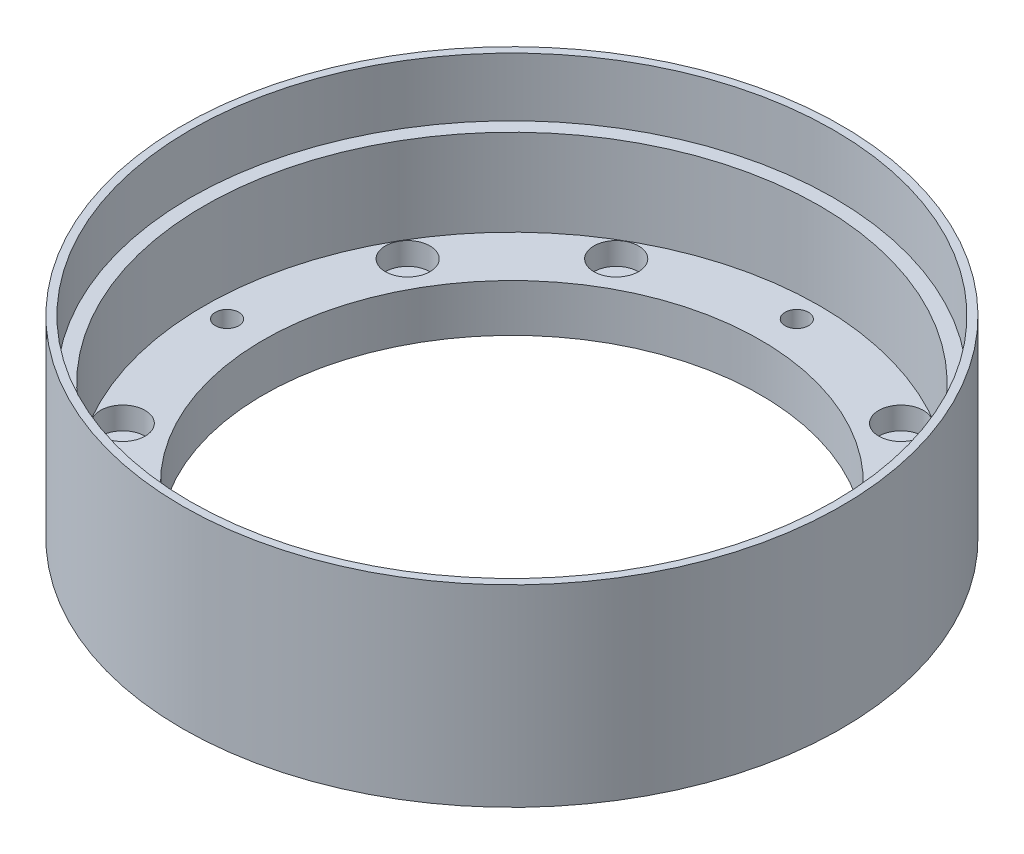
ISO-10303-21;
HEADER;
FILE_DESCRIPTION(('STEP AP214'),'2;1');
FILE_NAME('part.step','',(''),(''),'','','');
FILE_SCHEMA(('AUTOMOTIVE_DESIGN { 1 0 10303 214 1 1 1 1 }'));
ENDSEC;
DATA;
#1=APPLICATION_CONTEXT('core data for automotive mechanical design processes');
#2=APPLICATION_PROTOCOL_DEFINITION('international standard','automotive_design',2000,#1);
#3=PRODUCT_CONTEXT('',#1,'mechanical');
#4=PRODUCT('Part','Part','',(#3));
#5=PRODUCT_RELATED_PRODUCT_CATEGORY('part','',(#4));
#6=PRODUCT_DEFINITION_FORMATION('','',#4);
#7=PRODUCT_DEFINITION_CONTEXT('part definition',#1,'design');
#8=PRODUCT_DEFINITION('design','',#6,#7);
#9=PRODUCT_DEFINITION_SHAPE('','',#8);
#10=(LENGTH_UNIT() NAMED_UNIT(*) SI_UNIT(.MILLI.,.METRE.));
#11=(NAMED_UNIT(*) PLANE_ANGLE_UNIT() SI_UNIT($,.RADIAN.));
#12=(NAMED_UNIT(*) SI_UNIT($,.STERADIAN.) SOLID_ANGLE_UNIT());
#13=UNCERTAINTY_MEASURE_WITH_UNIT(LENGTH_MEASURE(1.E-05),#10,'distance_accuracy_value','');
#14=(GEOMETRIC_REPRESENTATION_CONTEXT(3) GLOBAL_UNCERTAINTY_ASSIGNED_CONTEXT((#13)) GLOBAL_UNIT_ASSIGNED_CONTEXT((#10,
#11,#12)) REPRESENTATION_CONTEXT('',''));
#15=CARTESIAN_POINT('',(0.,0.,0.));
#16=DIRECTION('',(0.,0.,1.));
#17=DIRECTION('',(1.,0.,0.));
#18=AXIS2_PLACEMENT_3D('',#15,#16,#17);
#19=CARTESIAN_POINT('',(-51.,0.,-5.34196644842999E-13));
#20=DIRECTION('',(0.,1.,0.));
#21=DIRECTION('',(0.,0.,1.));
#22=AXIS2_PLACEMENT_3D('',#19,#20,#21);
#23=CYLINDRICAL_SURFACE('',#22,2.1);
#24=CARTESIAN_POINT('',(-51.,8.5,-5.34196644842999E-13));
#25=DIRECTION('',(0.,1.,0.));
#26=DIRECTION('',(0.,0.,1.));
#27=AXIS2_PLACEMENT_3D('',#24,#25,#26);
#28=CIRCLE('',#27,2.1);
#29=CARTESIAN_POINT('',(-51.,8.5,2.09999999999947));
#30=VERTEX_POINT('',#29);
#31=EDGE_CURVE('E82',#30,#30,#28,.T.);
#32=ORIENTED_EDGE('',*,*,#31,.T.);
#33=EDGE_LOOP('',(#32));
#34=FACE_BOUND('',#33,.T.);
#35=CARTESIAN_POINT('',(-51.,5.,-5.34196644842999E-13));
#36=DIRECTION('',(0.,-1.,0.));
#37=DIRECTION('',(0.,0.,-1.));
#38=AXIS2_PLACEMENT_3D('',#35,#36,#37);
#39=CIRCLE('',#38,2.1);
#40=CARTESIAN_POINT('',(-51.,5.,-2.10000000000053));
#41=VERTEX_POINT('',#40);
#42=EDGE_CURVE('E47',#41,#41,#39,.F.);
#43=ORIENTED_EDGE('',*,*,#42,.F.);
#44=EDGE_LOOP('',(#43));
#45=FACE_BOUND('',#44,.T.);
#46=ADVANCED_FACE('F43',(#34,#45),#23,.F.);
#47=CARTESIAN_POINT('',(-3.56131096562E-13,0.,51.));
#48=DIRECTION('',(0.,1.,0.));
#49=DIRECTION('',(0.,0.,1.));
#50=AXIS2_PLACEMENT_3D('',#47,#48,#49);
#51=CYLINDRICAL_SURFACE('',#50,2.1);
#52=CARTESIAN_POINT('',(-3.56131096562E-13,8.5,51.));
#53=DIRECTION('',(0.,1.,0.));
#54=DIRECTION('',(0.,0.,1.));
#55=AXIS2_PLACEMENT_3D('',#52,#53,#54);
#56=CIRCLE('',#55,2.1);
#57=CARTESIAN_POINT('',(-3.56131096562E-13,8.5,53.1));
#58=VERTEX_POINT('',#57);
#59=EDGE_CURVE('E88',#58,#58,#56,.T.);
#60=ORIENTED_EDGE('',*,*,#59,.T.);
#61=EDGE_LOOP('',(#60));
#62=FACE_BOUND('',#61,.T.);
#63=CARTESIAN_POINT('',(-3.56131096562E-13,5.,51.));
#64=DIRECTION('',(0.,-1.,0.));
#65=DIRECTION('',(0.,0.,-1.));
#66=AXIS2_PLACEMENT_3D('',#63,#64,#65);
#67=CIRCLE('',#66,2.1);
#68=CARTESIAN_POINT('',(-3.56131096562E-13,5.,48.9));
#69=VERTEX_POINT('',#68);
#70=EDGE_CURVE('E73',#69,#69,#67,.F.);
#71=ORIENTED_EDGE('',*,*,#70,.F.);
#72=EDGE_LOOP('',(#71));
#73=FACE_BOUND('',#72,.T.);
#74=ADVANCED_FACE('F198',(#62,#73),#51,.F.);
#75=CARTESIAN_POINT('',(51.,0.,1.78065548281E-13));
#76=DIRECTION('',(0.,1.,0.));
#77=DIRECTION('',(0.,0.,1.));
#78=AXIS2_PLACEMENT_3D('',#75,#76,#77);
#79=CYLINDRICAL_SURFACE('',#78,2.1);
#80=CARTESIAN_POINT('',(51.,8.5,1.78065548281E-13));
#81=DIRECTION('',(0.,1.,0.));
#82=DIRECTION('',(0.,0.,1.));
#83=AXIS2_PLACEMENT_3D('',#80,#81,#82);
#84=CIRCLE('',#83,2.1);
#85=CARTESIAN_POINT('',(51.,8.5,2.10000000000018));
#86=VERTEX_POINT('',#85);
#87=EDGE_CURVE('E95',#86,#86,#84,.T.);
#88=ORIENTED_EDGE('',*,*,#87,.T.);
#89=EDGE_LOOP('',(#88));
#90=FACE_BOUND('',#89,.T.);
#91=CARTESIAN_POINT('',(51.,5.,1.78065548281E-13));
#92=DIRECTION('',(0.,-1.,0.));
#93=DIRECTION('',(0.,0.,-1.));
#94=AXIS2_PLACEMENT_3D('',#91,#92,#93);
#95=CIRCLE('',#94,2.1);
#96=CARTESIAN_POINT('',(51.,5.,-2.09999999999982));
#97=VERTEX_POINT('',#96);
#98=EDGE_CURVE('E69',#97,#97,#95,.F.);
#99=ORIENTED_EDGE('',*,*,#98,.F.);
#100=EDGE_LOOP('',(#99));
#101=FACE_BOUND('',#100,.T.);
#102=ADVANCED_FACE('F202',(#90,#101),#79,.F.);
#103=CARTESIAN_POINT('',(0.,0.,-51.));
#104=DIRECTION('',(0.,1.,0.));
#105=DIRECTION('',(0.,0.,1.));
#106=AXIS2_PLACEMENT_3D('',#103,#104,#105);
#107=CYLINDRICAL_SURFACE('',#106,2.1);
#108=CARTESIAN_POINT('',(0.,8.5,-51.));
#109=DIRECTION('',(0.,1.,0.));
#110=DIRECTION('',(0.,0.,1.));
#111=AXIS2_PLACEMENT_3D('',#108,#109,#110);
#112=CIRCLE('',#111,2.1);
#113=CARTESIAN_POINT('',(0.,8.5,-48.9));
#114=VERTEX_POINT('',#113);
#115=EDGE_CURVE('E124',#114,#114,#112,.T.);
#116=ORIENTED_EDGE('',*,*,#115,.T.);
#117=EDGE_LOOP('',(#116));
#118=FACE_BOUND('',#117,.T.);
#119=CARTESIAN_POINT('',(0.,5.,-51.));
#120=DIRECTION('',(0.,-1.,0.));
#121=DIRECTION('',(0.,0.,-1.));
#122=AXIS2_PLACEMENT_3D('',#119,#120,#121);
#123=CIRCLE('',#122,2.1);
#124=CARTESIAN_POINT('',(0.,5.,-53.1));
#125=VERTEX_POINT('',#124);
#126=EDGE_CURVE('E65',#125,#125,#123,.F.);
#127=ORIENTED_EDGE('',*,*,#126,.F.);
#128=EDGE_LOOP('',(#127));
#129=FACE_BOUND('',#128,.T.);
#130=ADVANCED_FACE('F194',(#118,#129),#107,.F.);
#131=CARTESIAN_POINT('',(0.,34.5,0.));
#132=DIRECTION('',(0.,-1.,0.));
#133=DIRECTION('',(0.,0.,-1.));
#134=AXIS2_PLACEMENT_3D('',#131,#132,#133);
#135=CYLINDRICAL_SURFACE('',#134,59.);
#136=CARTESIAN_POINT('',(0.,34.5,0.));
#137=DIRECTION('',(0.,1.,0.));
#138=DIRECTION('',(0.,0.,1.));
#139=AXIS2_PLACEMENT_3D('',#136,#137,#138);
#140=CIRCLE('',#139,59.);
#141=CARTESIAN_POINT('',(0.,34.5,59.));
#142=VERTEX_POINT('',#141);
#143=EDGE_CURVE('E10',#142,#142,#140,.T.);
#144=ORIENTED_EDGE('',*,*,#143,.F.);
#145=EDGE_LOOP('',(#144));
#146=FACE_BOUND('',#145,.T.);
#147=CARTESIAN_POINT('',(0.,0.,0.));
#148=DIRECTION('',(0.,1.,0.));
#149=DIRECTION('',(0.,0.,1.));
#150=AXIS2_PLACEMENT_3D('',#147,#148,#149);
#151=CIRCLE('',#150,59.);
#152=CARTESIAN_POINT('',(0.,0.,59.));
#153=VERTEX_POINT('',#152);
#154=EDGE_CURVE('E52',#153,#153,#151,.T.);
#155=ORIENTED_EDGE('',*,*,#154,.T.);
#156=EDGE_LOOP('',(#155));
#157=FACE_BOUND('',#156,.T.);
#158=ADVANCED_FACE('F45',(#146,#157),#135,.T.);
#159=CARTESIAN_POINT('',(0.,34.5,0.));
#160=DIRECTION('',(0.,1.,0.));
#161=DIRECTION('',(0.,0.,1.));
#162=AXIS2_PLACEMENT_3D('',#159,#160,#161);
#163=PLANE('',#162);
#164=CARTESIAN_POINT('',(0.,34.5,0.));
#165=DIRECTION('',(0.,1.,0.));
#166=DIRECTION('',(0.,0.,1.));
#167=AXIS2_PLACEMENT_3D('',#164,#165,#166);
#168=CIRCLE('',#167,57.6);
#169=CARTESIAN_POINT('',(0.,34.5,57.6));
#170=VERTEX_POINT('',#169);
#171=EDGE_CURVE('E62',#170,#170,#168,.T.);
#172=ORIENTED_EDGE('',*,*,#171,.F.);
#173=EDGE_LOOP('',(#172));
#174=FACE_BOUND('',#173,.T.);
#175=ORIENTED_EDGE('',*,*,#143,.T.);
#176=EDGE_LOOP('',(#175));
#177=FACE_BOUND('',#176,.T.);
#178=ADVANCED_FACE('F186',(#174,#177),#163,.T.);
#179=CARTESIAN_POINT('',(0.,0.,0.));
#180=DIRECTION('',(0.,1.,0.));
#181=DIRECTION('',(0.,0.,1.));
#182=AXIS2_PLACEMENT_3D('',#179,#180,#181);
#183=PLANE('',#182);
#184=CARTESIAN_POINT('',(-3.56131096562E-13,0.,51.));
#185=DIRECTION('',(0.,-1.,0.));
#186=DIRECTION('',(0.,0.,-1.));
#187=AXIS2_PLACEMENT_3D('',#184,#185,#186);
#188=CIRCLE('',#187,3.75);
#189=CARTESIAN_POINT('',(-3.56131096562E-13,0.,47.25));
#190=VERTEX_POINT('',#189);
#191=EDGE_CURVE('E608',#190,#190,#188,.T.);
#192=ORIENTED_EDGE('',*,*,#191,.F.);
#193=EDGE_LOOP('',(#192));
#194=FACE_BOUND('',#193,.T.);
#195=CARTESIAN_POINT('',(51.,0.,1.85004442184907E-13));
#196=DIRECTION('',(0.,-1.,0.));
#197=DIRECTION('',(0.,0.,-1.));
#198=AXIS2_PLACEMENT_3D('',#195,#196,#197);
#199=CIRCLE('',#198,3.75);
#200=CARTESIAN_POINT('',(51.,0.,-3.74999999999982));
#201=VERTEX_POINT('',#200);
#202=EDGE_CURVE('E604',#201,#201,#199,.T.);
#203=ORIENTED_EDGE('',*,*,#202,.F.);
#204=EDGE_LOOP('',(#203));
#205=FACE_BOUND('',#204,.T.);
#206=CARTESIAN_POINT('',(0.,0.,-51.));
#207=DIRECTION('',(0.,-1.,0.));
#208=DIRECTION('',(0.,0.,-1.));
#209=AXIS2_PLACEMENT_3D('',#206,#207,#208);
#210=CIRCLE('',#209,3.75);
#211=CARTESIAN_POINT('',(0.,0.,-54.75));
#212=VERTEX_POINT('',#211);
#213=EDGE_CURVE('E597',#212,#212,#210,.T.);
#214=ORIENTED_EDGE('',*,*,#213,.F.);
#215=EDGE_LOOP('',(#214));
#216=FACE_BOUND('',#215,.T.);
#217=CARTESIAN_POINT('',(-51.,0.,1.78065548281E-13));
#218=DIRECTION('',(0.,-1.,0.));
#219=DIRECTION('',(0.,0.,-1.));
#220=AXIS2_PLACEMENT_3D('',#217,#218,#219);
#221=CIRCLE('',#220,3.75);
#222=CARTESIAN_POINT('',(-51.,0.,-3.74999999999982));
#223=VERTEX_POINT('',#222);
#224=EDGE_CURVE('E589',#223,#223,#221,.T.);
#225=ORIENTED_EDGE('',*,*,#224,.F.);
#226=EDGE_LOOP('',(#225));
#227=FACE_BOUND('',#226,.T.);
#228=CARTESIAN_POINT('',(0.,0.,0.));
#229=DIRECTION('',(0.,1.,0.));
#230=DIRECTION('',(0.,0.,1.));
#231=AXIS2_PLACEMENT_3D('',#228,#229,#230);
#232=CIRCLE('',#231,44.5);
#233=CARTESIAN_POINT('',(0.,0.,44.5));
#234=VERTEX_POINT('',#233);
#235=EDGE_CURVE('E161',#234,#234,#232,.T.);
#236=ORIENTED_EDGE('',*,*,#235,.T.);
#237=EDGE_LOOP('',(#236));
#238=FACE_BOUND('',#237,.T.);
#239=ORIENTED_EDGE('',*,*,#154,.F.);
#240=EDGE_LOOP('',(#239));
#241=FACE_BOUND('',#240,.T.);
#242=ADVANCED_FACE('F188',(#194,#205,#216,#227,#238,#241),#183,.F.);
#243=CARTESIAN_POINT('',(0.,24.,0.));
#244=DIRECTION('',(0.,1.,0.));
#245=DIRECTION('',(0.,0.,1.));
#246=AXIS2_PLACEMENT_3D('',#243,#244,#245);
#247=CYLINDRICAL_SURFACE('',#246,57.6);
#248=CARTESIAN_POINT('',(0.,24.,0.));
#249=DIRECTION('',(0.,1.,0.));
#250=DIRECTION('',(0.,0.,1.));
#251=AXIS2_PLACEMENT_3D('',#248,#249,#250);
#252=CIRCLE('',#251,57.6);
#253=CARTESIAN_POINT('',(0.,24.,57.6));
#254=VERTEX_POINT('',#253);
#255=EDGE_CURVE('E59',#254,#254,#252,.T.);
#256=CARTESIAN_POINT('',(0.,24.,57.6));
#257=CARTESIAN_POINT('',(0.,24.109375,57.6));
#258=CARTESIAN_POINT('',(0.,24.21875,57.6));
#259=CARTESIAN_POINT('',(0.,24.4375,57.6));
#260=CARTESIAN_POINT('',(0.,24.546875,57.6));
#261=CARTESIAN_POINT('',(0.,24.765625,57.6));
#262=CARTESIAN_POINT('',(0.,24.875,57.6));
#263=CARTESIAN_POINT('',(0.,25.09375,57.6));
#264=CARTESIAN_POINT('',(0.,25.203125,57.6));
#265=CARTESIAN_POINT('',(0.,25.421875,57.6));
#266=CARTESIAN_POINT('',(0.,25.53125,57.6));
#267=CARTESIAN_POINT('',(0.,25.75,57.6));
#268=CARTESIAN_POINT('',(0.,25.859375,57.6));
#269=CARTESIAN_POINT('',(0.,26.078125,57.6));
#270=CARTESIAN_POINT('',(0.,26.1875,57.6));
#271=CARTESIAN_POINT('',(0.,26.40625,57.6));
#272=CARTESIAN_POINT('',(0.,26.515625,57.6));
#273=CARTESIAN_POINT('',(0.,26.734375,57.6));
#274=CARTESIAN_POINT('',(0.,26.84375,57.6));
#275=CARTESIAN_POINT('',(0.,27.0625,57.6));
#276=CARTESIAN_POINT('',(0.,27.171875,57.6));
#277=CARTESIAN_POINT('',(0.,27.390625,57.6));
#278=CARTESIAN_POINT('',(0.,27.5,57.6));
#279=CARTESIAN_POINT('',(0.,27.71875,57.6));
#280=CARTESIAN_POINT('',(0.,27.828125,57.6));
#281=CARTESIAN_POINT('',(0.,28.046875,57.6));
#282=CARTESIAN_POINT('',(0.,28.15625,57.6));
#283=CARTESIAN_POINT('',(0.,28.375,57.6));
#284=CARTESIAN_POINT('',(0.,28.484375,57.6));
#285=CARTESIAN_POINT('',(0.,28.703125,57.6));
#286=CARTESIAN_POINT('',(0.,28.8125,57.6));
#287=CARTESIAN_POINT('',(0.,29.03125,57.6));
#288=CARTESIAN_POINT('',(0.,29.140625,57.6));
#289=CARTESIAN_POINT('',(0.,29.359375,57.6));
#290=CARTESIAN_POINT('',(0.,29.46875,57.6));
#291=CARTESIAN_POINT('',(0.,29.6875,57.6));
#292=CARTESIAN_POINT('',(0.,29.796875,57.6));
#293=CARTESIAN_POINT('',(0.,30.015625,57.6));
#294=CARTESIAN_POINT('',(0.,30.125,57.6));
#295=CARTESIAN_POINT('',(0.,30.34375,57.6));
#296=CARTESIAN_POINT('',(0.,30.453125,57.6));
#297=CARTESIAN_POINT('',(0.,30.671875,57.6));
#298=CARTESIAN_POINT('',(0.,30.78125,57.6));
#299=CARTESIAN_POINT('',(0.,31.,57.6));
#300=CARTESIAN_POINT('',(0.,31.109375,57.6));
#301=CARTESIAN_POINT('',(0.,31.328125,57.6));
#302=CARTESIAN_POINT('',(0.,31.4375,57.6));
#303=CARTESIAN_POINT('',(0.,31.65625,57.6));
#304=CARTESIAN_POINT('',(0.,31.765625,57.6));
#305=CARTESIAN_POINT('',(0.,31.984375,57.6));
#306=CARTESIAN_POINT('',(0.,32.09375,57.6));
#307=CARTESIAN_POINT('',(0.,32.3125,57.6));
#308=CARTESIAN_POINT('',(0.,32.421875,57.6));
#309=CARTESIAN_POINT('',(0.,32.640625,57.6));
#310=CARTESIAN_POINT('',(0.,32.75,57.6));
#311=CARTESIAN_POINT('',(0.,32.96875,57.6));
#312=CARTESIAN_POINT('',(0.,33.078125,57.6));
#313=CARTESIAN_POINT('',(0.,33.296875,57.6));
#314=CARTESIAN_POINT('',(0.,33.40625,57.6));
#315=CARTESIAN_POINT('',(0.,33.625,57.6));
#316=CARTESIAN_POINT('',(0.,33.734375,57.6));
#317=CARTESIAN_POINT('',(0.,33.953125,57.6));
#318=CARTESIAN_POINT('',(0.,34.0625,57.6));
#319=CARTESIAN_POINT('',(0.,34.28125,57.6));
#320=CARTESIAN_POINT('',(0.,34.390625,57.6));
#321=CARTESIAN_POINT('',(0.,34.5,57.6));
#322=B_SPLINE_CURVE_WITH_KNOTS('',3,(#256,#257,#258,#259,#260,#261,#262,#263,#264,#265,#266,
#267,#268,#269,#270,#271,#272,#273,#274,#275,#276,#277,#278,#279,#280,#281,#282,#283,#284,#285,
#286,#287,#288,#289,#290,#291,#292,#293,#294,#295,#296,#297,#298,#299,#300,#301,#302,#303,#304,
#305,#306,#307,#308,#309,#310,#311,#312,#313,#314,#315,#316,#317,#318,#319,#320,#321),
.UNSPECIFIED.,.F.,.F.,(4,2,2,2,2,2,2,2,2,2,2,2,2,2,2,2,2,2,2,2,2,2,2,2,2,2,2,2,2,2,2,2,4),(0.,
0.328124999999999,0.656249999999997,0.984374999999999,1.3125,1.640625,1.96875,2.296875,2.625,
2.953125,3.28125,3.609375,3.9375,4.265625,4.59375,4.921875,5.25,5.578125,5.90625,6.234375,
6.5625,6.890625,7.21875,7.546875,7.875,8.203125,8.53125,8.859375,9.18749999999999,
9.51562499999999,9.84375,10.171875,10.5),.UNSPECIFIED.);
#323=EDGE_CURVE('BSEAM184',#254,#170,#322,.T.);
#324=ORIENTED_EDGE('',*,*,#255,.F.);
#325=ORIENTED_EDGE('',*,*,#171,.T.);
#326=ORIENTED_EDGE('',*,*,#323,.T.);
#327=ORIENTED_EDGE('',*,*,#323,.F.);
#328=EDGE_LOOP('',(#324,#326,#325,#327));
#329=FACE_BOUND('',#328,.T.);
#330=ADVANCED_FACE('F184',(#329),#247,.F.);
#331=CARTESIAN_POINT('',(0.,24.,0.));
#332=DIRECTION('',(0.,1.,0.));
#333=DIRECTION('',(0.,0.,1.));
#334=AXIS2_PLACEMENT_3D('',#331,#332,#333);
#335=PLANE('',#334);
#336=CARTESIAN_POINT('',(0.,24.,0.));
#337=DIRECTION('',(0.,1.,0.));
#338=DIRECTION('',(0.,0.,1.));
#339=AXIS2_PLACEMENT_3D('',#336,#337,#338);
#340=CIRCLE('',#339,55.1);
#341=CARTESIAN_POINT('',(0.,24.,55.1));
#342=VERTEX_POINT('',#341);
#343=EDGE_CURVE('E165',#342,#342,#340,.T.);
#344=ORIENTED_EDGE('',*,*,#343,.F.);
#345=EDGE_LOOP('',(#344));
#346=FACE_BOUND('',#345,.T.);
#347=ORIENTED_EDGE('',*,*,#255,.T.);
#348=EDGE_LOOP('',(#347));
#349=FACE_BOUND('',#348,.T.);
#350=ADVANCED_FACE('F284',(#346,#349),#335,.T.);
#351=CARTESIAN_POINT('',(0.,8.5,0.));
#352=DIRECTION('',(0.,1.,0.));
#353=DIRECTION('',(0.,0.,1.));
#354=AXIS2_PLACEMENT_3D('',#351,#352,#353);
#355=CYLINDRICAL_SURFACE('',#354,55.1);
#356=CARTESIAN_POINT('',(0.,8.5,0.));
#357=DIRECTION('',(0.,1.,0.));
#358=DIRECTION('',(0.,0.,1.));
#359=AXIS2_PLACEMENT_3D('',#356,#357,#358);
#360=CIRCLE('',#359,55.1);
#361=CARTESIAN_POINT('',(0.,8.5,55.1));
#362=VERTEX_POINT('',#361);
#363=EDGE_CURVE('E169',#362,#362,#360,.T.);
#364=ORIENTED_EDGE('',*,*,#363,.F.);
#365=EDGE_LOOP('',(#364));
#366=FACE_BOUND('',#365,.T.);
#367=ORIENTED_EDGE('',*,*,#343,.T.);
#368=EDGE_LOOP('',(#367));
#369=FACE_BOUND('',#368,.T.);
#370=ADVANCED_FACE('F280',(#366,#369),#355,.F.);
#371=CARTESIAN_POINT('',(0.,8.5,0.));
#372=DIRECTION('',(0.,1.,0.));
#373=DIRECTION('',(0.,0.,1.));
#374=AXIS2_PLACEMENT_3D('',#371,#372,#373);
#375=PLANE('',#374);
#376=ORIENTED_EDGE('',*,*,#115,.F.);
#377=EDGE_LOOP('',(#376));
#378=FACE_BOUND('',#377,.T.);
#379=ORIENTED_EDGE('',*,*,#87,.F.);
#380=EDGE_LOOP('',(#379));
#381=FACE_BOUND('',#380,.T.);
#382=ORIENTED_EDGE('',*,*,#59,.F.);
#383=EDGE_LOOP('',(#382));
#384=FACE_BOUND('',#383,.T.);
#385=ORIENTED_EDGE('',*,*,#31,.F.);
#386=EDGE_LOOP('',(#385));
#387=FACE_BOUND('',#386,.T.);
#388=CARTESIAN_POINT('',(-25.4999999999999,8.5,-44.1672955930064));
#389=DIRECTION('',(0.,1.,0.));
#390=DIRECTION('',(0.,0.,1.));
#391=AXIS2_PLACEMENT_3D('',#388,#389,#390);
#392=CIRCLE('',#391,4.);
#393=CARTESIAN_POINT('',(-25.4999999999999,8.5,-40.1672955930064));
#394=VERTEX_POINT('',#393);
#395=EDGE_CURVE('E125',#394,#394,#392,.T.);
#396=ORIENTED_EDGE('',*,*,#395,.F.);
#397=EDGE_LOOP('',(#396));
#398=FACE_BOUND('',#397,.T.);
#399=CARTESIAN_POINT('',(25.5000000000002,8.5,-44.1672955930063));
#400=DIRECTION('',(0.,1.,0.));
#401=DIRECTION('',(0.,0.,1.));
#402=AXIS2_PLACEMENT_3D('',#399,#400,#401);
#403=CIRCLE('',#402,4.);
#404=CARTESIAN_POINT('',(25.5000000000002,8.5,-40.1672955930063));
#405=VERTEX_POINT('',#404);
#406=EDGE_CURVE('E134',#405,#405,#403,.T.);
#407=ORIENTED_EDGE('',*,*,#406,.F.);
#408=EDGE_LOOP('',(#407));
#409=FACE_BOUND('',#408,.T.);
#410=CARTESIAN_POINT('',(44.1672955930065,8.5,-25.4999999999998));
#411=DIRECTION('',(0.,1.,0.));
#412=DIRECTION('',(0.,0.,1.));
#413=AXIS2_PLACEMENT_3D('',#410,#411,#412);
#414=CIRCLE('',#413,4.);
#415=CARTESIAN_POINT('',(44.1672955930065,8.5,-21.4999999999998));
#416=VERTEX_POINT('',#415);
#417=EDGE_CURVE('E140',#416,#416,#414,.T.);
#418=ORIENTED_EDGE('',*,*,#417,.F.);
#419=EDGE_LOOP('',(#418));
#420=FACE_BOUND('',#419,.T.);
#421=CARTESIAN_POINT('',(44.1672955930062,8.5,25.5000000000003));
#422=DIRECTION('',(0.,1.,0.));
#423=DIRECTION('',(0.,0.,1.));
#424=AXIS2_PLACEMENT_3D('',#421,#422,#423);
#425=CIRCLE('',#424,4.);
#426=CARTESIAN_POINT('',(44.1672955930062,8.5,29.5000000000003));
#427=VERTEX_POINT('',#426);
#428=EDGE_CURVE('E147',#427,#427,#425,.T.);
#429=ORIENTED_EDGE('',*,*,#428,.F.);
#430=EDGE_LOOP('',(#429));
#431=FACE_BOUND('',#430,.T.);
#432=CARTESIAN_POINT('',(25.4999999999996,8.5,44.1672955930066));
#433=DIRECTION('',(0.,1.,0.));
#434=DIRECTION('',(0.,0.,1.));
#435=AXIS2_PLACEMENT_3D('',#432,#433,#434);
#436=CIRCLE('',#435,4.);
#437=CARTESIAN_POINT('',(25.4999999999996,8.5,48.1672955930066));
#438=VERTEX_POINT('',#437);
#439=EDGE_CURVE('E99',#438,#438,#436,.T.);
#440=ORIENTED_EDGE('',*,*,#439,.F.);
#441=EDGE_LOOP('',(#440));
#442=FACE_BOUND('',#441,.T.);
#443=CARTESIAN_POINT('',(-25.5000000000005,8.5,44.1672955930061));
#444=DIRECTION('',(0.,1.,0.));
#445=DIRECTION('',(0.,0.,1.));
#446=AXIS2_PLACEMENT_3D('',#443,#444,#445);
#447=CIRCLE('',#446,4.00000000000001);
#448=CARTESIAN_POINT('',(-25.5000000000005,8.5,48.1672955930061));
#449=VERTEX_POINT('',#448);
#450=EDGE_CURVE('E108',#449,#449,#447,.T.);
#451=ORIENTED_EDGE('',*,*,#450,.F.);
#452=EDGE_LOOP('',(#451));
#453=FACE_BOUND('',#452,.T.);
#454=CARTESIAN_POINT('',(-44.1672955930067,8.5,25.4999999999995));
#455=DIRECTION('',(0.,1.,0.));
#456=DIRECTION('',(0.,0.,1.));
#457=AXIS2_PLACEMENT_3D('',#454,#455,#456);
#458=CIRCLE('',#457,4.);
#459=CARTESIAN_POINT('',(-44.1672955930067,8.5,29.4999999999995));
#460=VERTEX_POINT('',#459);
#461=EDGE_CURVE('E116',#460,#460,#458,.T.);
#462=ORIENTED_EDGE('',*,*,#461,.F.);
#463=EDGE_LOOP('',(#462));
#464=FACE_BOUND('',#463,.T.);
#465=CARTESIAN_POINT('',(-44.1672955930064,8.5,-25.5));
#466=DIRECTION('',(0.,1.,0.));
#467=DIRECTION('',(0.,0.,1.));
#468=AXIS2_PLACEMENT_3D('',#465,#466,#467);
#469=CIRCLE('',#468,4.);
#470=CARTESIAN_POINT('',(-44.1672955930064,8.5,-21.5));
#471=VERTEX_POINT('',#470);
#472=EDGE_CURVE('E129',#471,#471,#469,.T.);
#473=ORIENTED_EDGE('',*,*,#472,.F.);
#474=EDGE_LOOP('',(#473));
#475=FACE_BOUND('',#474,.T.);
#476=CARTESIAN_POINT('',(0.,8.5,0.));
#477=DIRECTION('',(0.,1.,0.));
#478=DIRECTION('',(0.,0.,1.));
#479=AXIS2_PLACEMENT_3D('',#476,#477,#478);
#480=CIRCLE('',#479,44.5);
#481=CARTESIAN_POINT('',(0.,8.5,44.5));
#482=VERTEX_POINT('',#481);
#483=EDGE_CURVE('E157',#482,#482,#480,.T.);
#484=ORIENTED_EDGE('',*,*,#483,.F.);
#485=EDGE_LOOP('',(#484));
#486=FACE_BOUND('',#485,.T.);
#487=ORIENTED_EDGE('',*,*,#363,.T.);
#488=EDGE_LOOP('',(#487));
#489=FACE_BOUND('',#488,.T.);
#490=ADVANCED_FACE('F276',(#378,#381,#384,#387,#398,#409,#420,#431,#442,#453,#464,#475,#486,
#489),#375,.T.);
#491=CARTESIAN_POINT('',(0.,0.,0.));
#492=DIRECTION('',(0.,1.,0.));
#493=DIRECTION('',(0.,0.,1.));
#494=AXIS2_PLACEMENT_3D('',#491,#492,#493);
#495=CYLINDRICAL_SURFACE('',#494,44.5);
#496=ORIENTED_EDGE('',*,*,#235,.F.);
#497=EDGE_LOOP('',(#496));
#498=FACE_BOUND('',#497,.T.);
#499=ORIENTED_EDGE('',*,*,#483,.T.);
#500=EDGE_LOOP('',(#499));
#501=FACE_BOUND('',#500,.T.);
#502=ADVANCED_FACE('F272',(#498,#501),#495,.F.);
#503=CARTESIAN_POINT('',(-44.1672955930064,4.5,-25.5));
#504=DIRECTION('',(0.,1.,0.));
#505=DIRECTION('',(0.,0.,1.));
#506=AXIS2_PLACEMENT_3D('',#503,#504,#505);
#507=CYLINDRICAL_SURFACE('',#506,4.);
#508=CARTESIAN_POINT('',(-44.1672955930064,4.5,-25.5));
#509=DIRECTION('',(0.,1.,0.));
#510=DIRECTION('',(0.,0.,1.));
#511=AXIS2_PLACEMENT_3D('',#508,#509,#510);
#512=CIRCLE('',#511,4.);
#513=CARTESIAN_POINT('',(-44.1672955930064,4.5,-21.5));
#514=VERTEX_POINT('',#513);
#515=EDGE_CURVE('E153',#514,#514,#512,.T.);
#516=ORIENTED_EDGE('',*,*,#515,.F.);
#517=EDGE_LOOP('',(#516));
#518=FACE_BOUND('',#517,.T.);
#519=ORIENTED_EDGE('',*,*,#472,.T.);
#520=EDGE_LOOP('',(#519));
#521=FACE_BOUND('',#520,.T.);
#522=ADVANCED_FACE('F268',(#518,#521),#507,.F.);
#523=CARTESIAN_POINT('',(-44.1672955930064,4.5,-25.5));
#524=DIRECTION('',(0.,1.,0.));
#525=DIRECTION('',(0.,0.,1.));
#526=AXIS2_PLACEMENT_3D('',#523,#524,#525);
#527=PLANE('',#526);
#528=ORIENTED_EDGE('',*,*,#515,.T.);
#529=EDGE_LOOP('',(#528));
#530=FACE_BOUND('',#529,.T.);
#531=ADVANCED_FACE('F229',(#530),#527,.T.);
#532=CARTESIAN_POINT('',(-44.1672955930067,4.5,25.4999999999995));
#533=DIRECTION('',(0.,1.,0.));
#534=DIRECTION('',(0.,0.,1.));
#535=AXIS2_PLACEMENT_3D('',#532,#533,#534);
#536=CYLINDRICAL_SURFACE('',#535,4.);
#537=CARTESIAN_POINT('',(-44.1672955930067,4.5,25.4999999999995));
#538=DIRECTION('',(0.,1.,0.));
#539=DIRECTION('',(0.,0.,1.));
#540=AXIS2_PLACEMENT_3D('',#537,#538,#539);
#541=CIRCLE('',#540,4.);
#542=CARTESIAN_POINT('',(-44.1672955930067,4.5,29.4999999999995));
#543=VERTEX_POINT('',#542);
#544=EDGE_CURVE('E120',#543,#543,#541,.T.);
#545=ORIENTED_EDGE('',*,*,#544,.F.);
#546=EDGE_LOOP('',(#545));
#547=FACE_BOUND('',#546,.T.);
#548=ORIENTED_EDGE('',*,*,#461,.T.);
#549=EDGE_LOOP('',(#548));
#550=FACE_BOUND('',#549,.T.);
#551=ADVANCED_FACE('F226',(#547,#550),#536,.F.);
#552=CARTESIAN_POINT('',(-44.1672955930067,4.5,25.4999999999995));
#553=DIRECTION('',(0.,1.,0.));
#554=DIRECTION('',(0.,0.,1.));
#555=AXIS2_PLACEMENT_3D('',#552,#553,#554);
#556=PLANE('',#555);
#557=ORIENTED_EDGE('',*,*,#544,.T.);
#558=EDGE_LOOP('',(#557));
#559=FACE_BOUND('',#558,.T.);
#560=ADVANCED_FACE('F221',(#559),#556,.T.);
#561=CARTESIAN_POINT('',(-25.5000000000005,4.5,44.1672955930061));
#562=DIRECTION('',(0.,1.,0.));
#563=DIRECTION('',(0.,0.,1.));
#564=AXIS2_PLACEMENT_3D('',#561,#562,#563);
#565=CYLINDRICAL_SURFACE('',#564,4.00000000000001);
#566=CARTESIAN_POINT('',(-25.5000000000005,4.5,44.1672955930061));
#567=DIRECTION('',(0.,1.,0.));
#568=DIRECTION('',(0.,0.,1.));
#569=AXIS2_PLACEMENT_3D('',#566,#567,#568);
#570=CIRCLE('',#569,4.00000000000001);
#571=CARTESIAN_POINT('',(-25.5000000000005,4.5,48.1672955930061));
#572=VERTEX_POINT('',#571);
#573=EDGE_CURVE('E112',#572,#572,#570,.T.);
#574=ORIENTED_EDGE('',*,*,#573,.F.);
#575=EDGE_LOOP('',(#574));
#576=FACE_BOUND('',#575,.T.);
#577=ORIENTED_EDGE('',*,*,#450,.T.);
#578=EDGE_LOOP('',(#577));
#579=FACE_BOUND('',#578,.T.);
#580=ADVANCED_FACE('F218',(#576,#579),#565,.F.);
#581=CARTESIAN_POINT('',(-25.5000000000005,4.5,44.1672955930061));
#582=DIRECTION('',(0.,1.,0.));
#583=DIRECTION('',(0.,0.,1.));
#584=AXIS2_PLACEMENT_3D('',#581,#582,#583);
#585=PLANE('',#584);
#586=ORIENTED_EDGE('',*,*,#573,.T.);
#587=EDGE_LOOP('',(#586));
#588=FACE_BOUND('',#587,.T.);
#589=ADVANCED_FACE('F212',(#588),#585,.T.);
#590=CARTESIAN_POINT('',(25.4999999999996,4.5,44.1672955930066));
#591=DIRECTION('',(0.,1.,0.));
#592=DIRECTION('',(0.,0.,1.));
#593=AXIS2_PLACEMENT_3D('',#590,#591,#592);
#594=CYLINDRICAL_SURFACE('',#593,4.);
#595=CARTESIAN_POINT('',(25.4999999999996,4.5,44.1672955930066));
#596=DIRECTION('',(0.,1.,0.));
#597=DIRECTION('',(0.,0.,1.));
#598=AXIS2_PLACEMENT_3D('',#595,#596,#597);
#599=CIRCLE('',#598,4.);
#600=CARTESIAN_POINT('',(25.4999999999996,4.5,48.1672955930066));
#601=VERTEX_POINT('',#600);
#602=EDGE_CURVE('E104',#601,#601,#599,.T.);
#603=ORIENTED_EDGE('',*,*,#602,.F.);
#604=EDGE_LOOP('',(#603));
#605=FACE_BOUND('',#604,.T.);
#606=ORIENTED_EDGE('',*,*,#439,.T.);
#607=EDGE_LOOP('',(#606));
#608=FACE_BOUND('',#607,.T.);
#609=ADVANCED_FACE('F208',(#605,#608),#594,.F.);
#610=CARTESIAN_POINT('',(25.4999999999996,4.5,44.1672955930066));
#611=DIRECTION('',(0.,1.,0.));
#612=DIRECTION('',(0.,0.,1.));
#613=AXIS2_PLACEMENT_3D('',#610,#611,#612);
#614=PLANE('',#613);
#615=ORIENTED_EDGE('',*,*,#602,.T.);
#616=EDGE_LOOP('',(#615));
#617=FACE_BOUND('',#616,.T.);
#618=ADVANCED_FACE('F211',(#617),#614,.T.);
#619=CARTESIAN_POINT('',(44.1672955930062,4.5,25.5000000000003));
#620=DIRECTION('',(0.,1.,0.));
#621=DIRECTION('',(0.,0.,1.));
#622=AXIS2_PLACEMENT_3D('',#619,#620,#621);
#623=CYLINDRICAL_SURFACE('',#622,4.);
#624=CARTESIAN_POINT('',(44.1672955930062,4.5,25.5000000000003));
#625=DIRECTION('',(0.,1.,0.));
#626=DIRECTION('',(0.,0.,1.));
#627=AXIS2_PLACEMENT_3D('',#624,#625,#626);
#628=CIRCLE('',#627,4.);
#629=CARTESIAN_POINT('',(44.1672955930062,4.5,29.5000000000003));
#630=VERTEX_POINT('',#629);
#631=EDGE_CURVE('E103',#630,#630,#628,.T.);
#632=ORIENTED_EDGE('',*,*,#631,.F.);
#633=EDGE_LOOP('',(#632));
#634=FACE_BOUND('',#633,.T.);
#635=ORIENTED_EDGE('',*,*,#428,.T.);
#636=EDGE_LOOP('',(#635));
#637=FACE_BOUND('',#636,.T.);
#638=ADVANCED_FACE('F216',(#634,#637),#623,.F.);
#639=CARTESIAN_POINT('',(44.1672955930062,4.5,25.5000000000003));
#640=DIRECTION('',(0.,1.,0.));
#641=DIRECTION('',(0.,0.,1.));
#642=AXIS2_PLACEMENT_3D('',#639,#640,#641);
#643=PLANE('',#642);
#644=ORIENTED_EDGE('',*,*,#631,.T.);
#645=EDGE_LOOP('',(#644));
#646=FACE_BOUND('',#645,.T.);
#647=ADVANCED_FACE('F255',(#646),#643,.T.);
#648=CARTESIAN_POINT('',(44.1672955930065,4.5,-25.4999999999998));
#649=DIRECTION('',(0.,1.,0.));
#650=DIRECTION('',(0.,0.,1.));
#651=AXIS2_PLACEMENT_3D('',#648,#649,#650);
#652=CYLINDRICAL_SURFACE('',#651,4.);
#653=CARTESIAN_POINT('',(44.1672955930065,4.5,-25.4999999999998));
#654=DIRECTION('',(0.,1.,0.));
#655=DIRECTION('',(0.,0.,1.));
#656=AXIS2_PLACEMENT_3D('',#653,#654,#655);
#657=CIRCLE('',#656,4.);
#658=CARTESIAN_POINT('',(44.1672955930065,4.5,-21.4999999999998));
#659=VERTEX_POINT('',#658);
#660=EDGE_CURVE('E144',#659,#659,#657,.T.);
#661=ORIENTED_EDGE('',*,*,#660,.F.);
#662=EDGE_LOOP('',(#661));
#663=FACE_BOUND('',#662,.T.);
#664=ORIENTED_EDGE('',*,*,#417,.T.);
#665=EDGE_LOOP('',(#664));
#666=FACE_BOUND('',#665,.T.);
#667=ADVANCED_FACE('F252',(#663,#666),#652,.F.);
#668=CARTESIAN_POINT('',(44.1672955930065,4.5,-25.4999999999998));
#669=DIRECTION('',(0.,1.,0.));
#670=DIRECTION('',(0.,0.,1.));
#671=AXIS2_PLACEMENT_3D('',#668,#669,#670);
#672=PLANE('',#671);
#673=ORIENTED_EDGE('',*,*,#660,.T.);
#674=EDGE_LOOP('',(#673));
#675=FACE_BOUND('',#674,.T.);
#676=ADVANCED_FACE('F247',(#675),#672,.T.);
#677=CARTESIAN_POINT('',(25.5000000000002,4.5,-44.1672955930063));
#678=DIRECTION('',(0.,1.,0.));
#679=DIRECTION('',(0.,0.,1.));
#680=AXIS2_PLACEMENT_3D('',#677,#678,#679);
#681=CYLINDRICAL_SURFACE('',#680,4.);
#682=CARTESIAN_POINT('',(25.5000000000002,4.5,-44.1672955930063));
#683=DIRECTION('',(0.,1.,0.));
#684=DIRECTION('',(0.,0.,1.));
#685=AXIS2_PLACEMENT_3D('',#682,#683,#684);
#686=CIRCLE('',#685,4.);
#687=CARTESIAN_POINT('',(25.5000000000002,4.5,-40.1672955930063));
#688=VERTEX_POINT('',#687);
#689=EDGE_CURVE('E137',#688,#688,#686,.T.);
#690=ORIENTED_EDGE('',*,*,#689,.F.);
#691=EDGE_LOOP('',(#690));
#692=FACE_BOUND('',#691,.T.);
#693=ORIENTED_EDGE('',*,*,#406,.T.);
#694=EDGE_LOOP('',(#693));
#695=FACE_BOUND('',#694,.T.);
#696=ADVANCED_FACE('F244',(#692,#695),#681,.F.);
#697=CARTESIAN_POINT('',(25.5000000000002,4.5,-44.1672955930063));
#698=DIRECTION('',(0.,1.,0.));
#699=DIRECTION('',(0.,0.,1.));
#700=AXIS2_PLACEMENT_3D('',#697,#698,#699);
#701=PLANE('',#700);
#702=ORIENTED_EDGE('',*,*,#689,.T.);
#703=EDGE_LOOP('',(#702));
#704=FACE_BOUND('',#703,.T.);
#705=ADVANCED_FACE('F238',(#704),#701,.T.);
#706=CARTESIAN_POINT('',(-25.4999999999999,4.5,-44.1672955930064));
#707=DIRECTION('',(0.,1.,0.));
#708=DIRECTION('',(0.,0.,1.));
#709=AXIS2_PLACEMENT_3D('',#706,#707,#708);
#710=CYLINDRICAL_SURFACE('',#709,4.);
#711=CARTESIAN_POINT('',(-25.4999999999999,4.5,-44.1672955930064));
#712=DIRECTION('',(0.,1.,0.));
#713=DIRECTION('',(0.,0.,1.));
#714=AXIS2_PLACEMENT_3D('',#711,#712,#713);
#715=CIRCLE('',#714,4.);
#716=CARTESIAN_POINT('',(-25.4999999999999,4.5,-40.1672955930064));
#717=VERTEX_POINT('',#716);
#718=EDGE_CURVE('E130',#717,#717,#715,.T.);
#719=ORIENTED_EDGE('',*,*,#718,.F.);
#720=EDGE_LOOP('',(#719));
#721=FACE_BOUND('',#720,.T.);
#722=ORIENTED_EDGE('',*,*,#395,.T.);
#723=EDGE_LOOP('',(#722));
#724=FACE_BOUND('',#723,.T.);
#725=ADVANCED_FACE('F234',(#721,#724),#710,.F.);
#726=CARTESIAN_POINT('',(-25.4999999999999,4.5,-44.1672955930064));
#727=DIRECTION('',(0.,1.,0.));
#728=DIRECTION('',(0.,0.,1.));
#729=AXIS2_PLACEMENT_3D('',#726,#727,#728);
#730=PLANE('',#729);
#731=ORIENTED_EDGE('',*,*,#718,.T.);
#732=EDGE_LOOP('',(#731));
#733=FACE_BOUND('',#732,.T.);
#734=ADVANCED_FACE('F237',(#733),#730,.T.);
#735=CARTESIAN_POINT('',(0.,5.,-51.));
#736=DIRECTION('',(0.,-1.,0.));
#737=DIRECTION('',(0.,0.,-1.));
#738=AXIS2_PLACEMENT_3D('',#735,#736,#737);
#739=PLANE('',#738);
#740=CARTESIAN_POINT('',(0.,5.,-51.));
#741=DIRECTION('',(0.,-1.,0.));
#742=DIRECTION('',(0.,0.,-1.));
#743=AXIS2_PLACEMENT_3D('',#740,#741,#742);
#744=CIRCLE('',#743,3.75);
#745=CARTESIAN_POINT('',(0.,5.,-54.75));
#746=VERTEX_POINT('',#745);
#747=EDGE_CURVE('E593',#746,#746,#744,.T.);
#748=ORIENTED_EDGE('',*,*,#747,.T.);
#749=EDGE_LOOP('',(#748));
#750=FACE_BOUND('',#749,.T.);
#751=ORIENTED_EDGE('',*,*,#126,.T.);
#752=EDGE_LOOP('',(#751));
#753=FACE_BOUND('',#752,.T.);
#754=ADVANCED_FACE('F242',(#750,#753),#739,.T.);
#755=CARTESIAN_POINT('',(0.,5.,-51.));
#756=DIRECTION('',(0.,-1.,0.));
#757=DIRECTION('',(0.,0.,-1.));
#758=AXIS2_PLACEMENT_3D('',#755,#756,#757);
#759=CYLINDRICAL_SURFACE('',#758,3.75);
#760=ORIENTED_EDGE('',*,*,#747,.F.);
#761=EDGE_LOOP('',(#760));
#762=FACE_BOUND('',#761,.T.);
#763=ORIENTED_EDGE('',*,*,#213,.T.);
#764=EDGE_LOOP('',(#763));
#765=FACE_BOUND('',#764,.T.);
#766=ADVANCED_FACE('F357',(#762,#765),#759,.F.);
#767=CARTESIAN_POINT('',(51.,5.,1.85004442184907E-13));
#768=DIRECTION('',(0.,-1.,0.));
#769=DIRECTION('',(0.,0.,-1.));
#770=AXIS2_PLACEMENT_3D('',#767,#768,#769);
#771=PLANE('',#770);
#772=CARTESIAN_POINT('',(51.,5.,1.85004442184907E-13));
#773=DIRECTION('',(0.,-1.,0.));
#774=DIRECTION('',(0.,0.,-1.));
#775=AXIS2_PLACEMENT_3D('',#772,#773,#774);
#776=CIRCLE('',#775,3.75);
#777=CARTESIAN_POINT('',(51.,5.,-3.74999999999982));
#778=VERTEX_POINT('',#777);
#779=EDGE_CURVE('E600',#778,#778,#776,.T.);
#780=ORIENTED_EDGE('',*,*,#779,.T.);
#781=EDGE_LOOP('',(#780));
#782=FACE_BOUND('',#781,.T.);
#783=ORIENTED_EDGE('',*,*,#98,.T.);
#784=EDGE_LOOP('',(#783));
#785=FACE_BOUND('',#784,.T.);
#786=ADVANCED_FACE('F364',(#782,#785),#771,.T.);
#787=CARTESIAN_POINT('',(51.,5.,1.85004442184907E-13));
#788=DIRECTION('',(0.,-1.,0.));
#789=DIRECTION('',(0.,0.,-1.));
#790=AXIS2_PLACEMENT_3D('',#787,#788,#789);
#791=CYLINDRICAL_SURFACE('',#790,3.75);
#792=ORIENTED_EDGE('',*,*,#779,.F.);
#793=EDGE_LOOP('',(#792));
#794=FACE_BOUND('',#793,.T.);
#795=ORIENTED_EDGE('',*,*,#202,.T.);
#796=EDGE_LOOP('',(#795));
#797=FACE_BOUND('',#796,.T.);
#798=ADVANCED_FACE('F371',(#794,#797),#791,.F.);
#799=CARTESIAN_POINT('',(-3.56131096562E-13,5.,51.));
#800=DIRECTION('',(0.,-1.,0.));
#801=DIRECTION('',(0.,0.,-1.));
#802=AXIS2_PLACEMENT_3D('',#799,#800,#801);
#803=PLANE('',#802);
#804=CARTESIAN_POINT('',(-3.56131096562E-13,5.,51.));
#805=DIRECTION('',(0.,-1.,0.));
#806=DIRECTION('',(0.,0.,-1.));
#807=AXIS2_PLACEMENT_3D('',#804,#805,#806);
#808=CIRCLE('',#807,3.75);
#809=CARTESIAN_POINT('',(-3.56131096562E-13,5.,47.25));
#810=VERTEX_POINT('',#809);
#811=EDGE_CURVE('E70',#810,#810,#808,.T.);
#812=ORIENTED_EDGE('',*,*,#811,.T.);
#813=EDGE_LOOP('',(#812));
#814=FACE_BOUND('',#813,.T.);
#815=ORIENTED_EDGE('',*,*,#70,.T.);
#816=EDGE_LOOP('',(#815));
#817=FACE_BOUND('',#816,.T.);
#818=ADVANCED_FACE('F378',(#814,#817),#803,.T.);
#819=CARTESIAN_POINT('',(-3.56131096562E-13,5.,51.));
#820=DIRECTION('',(0.,-1.,0.));
#821=DIRECTION('',(0.,0.,-1.));
#822=AXIS2_PLACEMENT_3D('',#819,#820,#821);
#823=CYLINDRICAL_SURFACE('',#822,3.75);
#824=ORIENTED_EDGE('',*,*,#811,.F.);
#825=EDGE_LOOP('',(#824));
#826=FACE_BOUND('',#825,.T.);
#827=ORIENTED_EDGE('',*,*,#191,.T.);
#828=EDGE_LOOP('',(#827));
#829=FACE_BOUND('',#828,.T.);
#830=ADVANCED_FACE('F385',(#826,#829),#823,.F.);
#831=CARTESIAN_POINT('',(-51.,5.,1.78065548281E-13));
#832=DIRECTION('',(0.,-1.,0.));
#833=DIRECTION('',(0.,0.,-1.));
#834=AXIS2_PLACEMENT_3D('',#831,#832,#833);
#835=PLANE('',#834);
#836=CARTESIAN_POINT('',(-51.,5.,1.78065548281E-13));
#837=DIRECTION('',(0.,-1.,0.));
#838=DIRECTION('',(0.,0.,-1.));
#839=AXIS2_PLACEMENT_3D('',#836,#837,#838);
#840=CIRCLE('',#839,3.75);
#841=CARTESIAN_POINT('',(-51.,5.,-3.74999999999982));
#842=VERTEX_POINT('',#841);
#843=EDGE_CURVE('E585',#842,#842,#840,.T.);
#844=ORIENTED_EDGE('',*,*,#843,.T.);
#845=EDGE_LOOP('',(#844));
#846=FACE_BOUND('',#845,.T.);
#847=ORIENTED_EDGE('',*,*,#42,.T.);
#848=EDGE_LOOP('',(#847));
#849=FACE_BOUND('',#848,.T.);
#850=ADVANCED_FACE('F392',(#846,#849),#835,.T.);
#851=CARTESIAN_POINT('',(-51.,5.,1.78065548281E-13));
#852=DIRECTION('',(0.,-1.,0.));
#853=DIRECTION('',(0.,0.,-1.));
#854=AXIS2_PLACEMENT_3D('',#851,#852,#853);
#855=CYLINDRICAL_SURFACE('',#854,3.75);
#856=ORIENTED_EDGE('',*,*,#843,.F.);
#857=EDGE_LOOP('',(#856));
#858=FACE_BOUND('',#857,.T.);
#859=ORIENTED_EDGE('',*,*,#224,.T.);
#860=EDGE_LOOP('',(#859));
#861=FACE_BOUND('',#860,.T.);
#862=ADVANCED_FACE('F399',(#858,#861),#855,.F.);
#863=CLOSED_SHELL('',(#46,#74,#102,#130,#158,#178,#242,#330,#350,#370,#490,#502,#522,#531,#551,
#560,#580,#589,#609,#618,#638,#647,#667,#676,#696,#705,#725,#734,#754,#766,#786,#798,#818,#830,
#850,#862));
#864=MANIFOLD_SOLID_BREP('B2',#863);
#865=ADVANCED_BREP_SHAPE_REPRESENTATION('',(#18,#864),#14);
#866=SHAPE_DEFINITION_REPRESENTATION(#9,#865);
ENDSEC;
END-ISO-10303-21;
